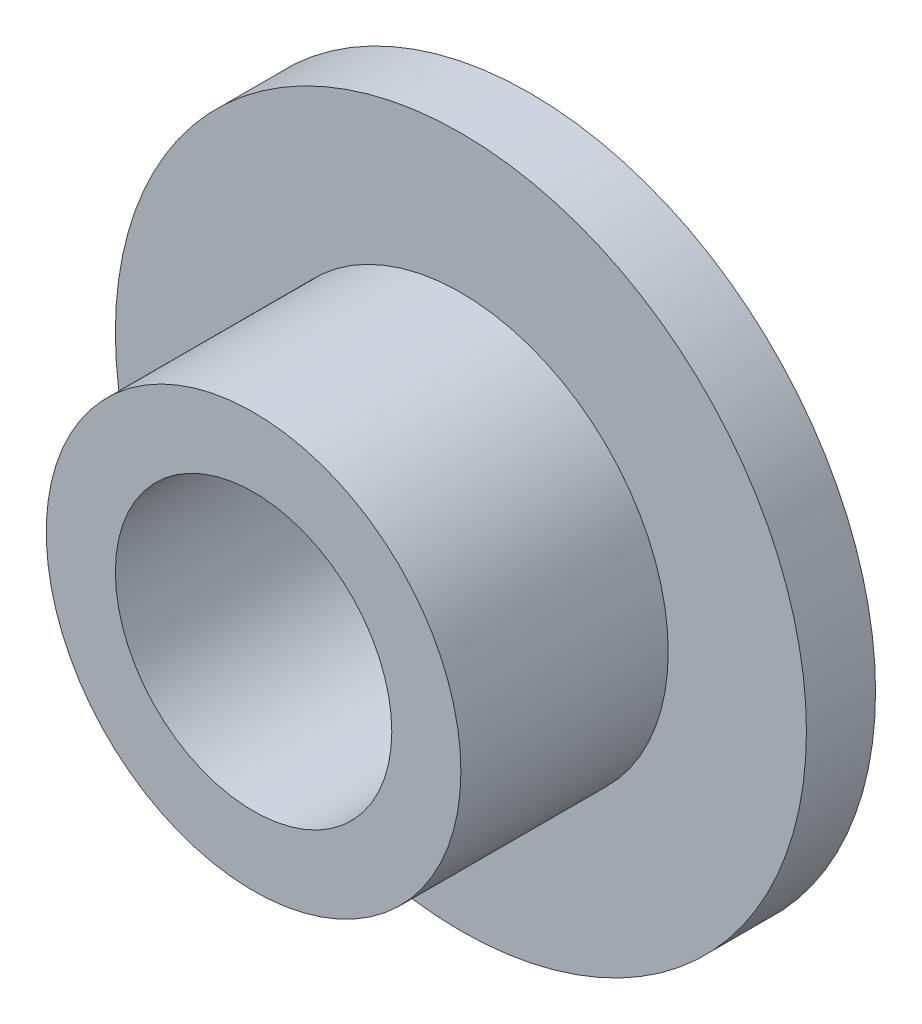
ISO-10303-21;
HEADER;
FILE_DESCRIPTION(('STEP AP214'),'2;1');
FILE_NAME('part.step','',(''),(''),'','','');
FILE_SCHEMA(('AUTOMOTIVE_DESIGN { 1 0 10303 214 1 1 1 1 }'));
ENDSEC;
DATA;
#1=APPLICATION_CONTEXT('core data for automotive mechanical design processes');
#2=APPLICATION_PROTOCOL_DEFINITION('international standard','automotive_design',2000,#1);
#3=PRODUCT_CONTEXT('',#1,'mechanical');
#4=PRODUCT('Part','Part','',(#3));
#5=PRODUCT_RELATED_PRODUCT_CATEGORY('part','',(#4));
#6=PRODUCT_DEFINITION_FORMATION('','',#4);
#7=PRODUCT_DEFINITION_CONTEXT('part definition',#1,'design');
#8=PRODUCT_DEFINITION('design','',#6,#7);
#9=PRODUCT_DEFINITION_SHAPE('','',#8);
#10=(LENGTH_UNIT() NAMED_UNIT(*) SI_UNIT(.MILLI.,.METRE.));
#11=(NAMED_UNIT(*) PLANE_ANGLE_UNIT() SI_UNIT($,.RADIAN.));
#12=(NAMED_UNIT(*) SI_UNIT($,.STERADIAN.) SOLID_ANGLE_UNIT());
#13=UNCERTAINTY_MEASURE_WITH_UNIT(LENGTH_MEASURE(1.E-05),#10,'distance_accuracy_value','');
#14=(GEOMETRIC_REPRESENTATION_CONTEXT(3) GLOBAL_UNCERTAINTY_ASSIGNED_CONTEXT((#13)) GLOBAL_UNIT_ASSIGNED_CONTEXT((#10,
#11,#12)) REPRESENTATION_CONTEXT('',''));
#15=CARTESIAN_POINT('',(0.,0.,0.));
#16=DIRECTION('',(0.,0.,1.));
#17=DIRECTION('',(1.,0.,0.));
#18=AXIS2_PLACEMENT_3D('',#15,#16,#17);
#19=CARTESIAN_POINT('',(0.,0.,0.));
#20=DIRECTION('',(0.,0.,1.));
#21=DIRECTION('',(1.,0.,0.));
#22=AXIS2_PLACEMENT_3D('',#19,#20,#21);
#23=PLANE('',#22);
#24=CARTESIAN_POINT('',(0.,0.,0.));
#25=DIRECTION('',(0.,0.,1.));
#26=DIRECTION('',(1.,0.,0.));
#27=AXIS2_PLACEMENT_3D('',#24,#25,#26);
#28=CIRCLE('',#27,250.);
#29=CARTESIAN_POINT('',(-250.,0.,0.));
#30=VERTEX_POINT('',#29);
#31=EDGE_CURVE('E11',#30,#30,#28,.T.);
#32=ORIENTED_EDGE('',*,*,#31,.F.);
#33=EDGE_LOOP('',(#32));
#34=FACE_BOUND('',#33,.T.);
#35=ADVANCED_FACE('F16',(#34),#23,.F.);
#36=CARTESIAN_POINT('',(0.,0.,50.));
#37=DIRECTION('',(0.,0.,1.));
#38=DIRECTION('',(1.,0.,0.));
#39=AXIS2_PLACEMENT_3D('',#36,#37,#38);
#40=PLANE('',#39);
#41=CARTESIAN_POINT('',(0.,0.,50.));
#42=DIRECTION('',(0.,0.,-1.));
#43=DIRECTION('',(-1.,0.,0.));
#44=AXIS2_PLACEMENT_3D('',#41,#42,#43);
#45=CIRCLE('',#44,150.);
#46=CARTESIAN_POINT('',(150.,0.,50.));
#47=VERTEX_POINT('',#46);
#48=EDGE_CURVE('E20',#47,#47,#45,.T.);
#49=ORIENTED_EDGE('',*,*,#48,.T.);
#50=EDGE_LOOP('',(#49));
#51=FACE_BOUND('',#50,.T.);
#52=CARTESIAN_POINT('',(0.,0.,50.));
#53=DIRECTION('',(0.,0.,1.));
#54=DIRECTION('',(1.,0.,0.));
#55=AXIS2_PLACEMENT_3D('',#52,#53,#54);
#56=CIRCLE('',#55,250.);
#57=CARTESIAN_POINT('',(-250.,0.,50.));
#58=VERTEX_POINT('',#57);
#59=EDGE_CURVE('E63',#58,#58,#56,.T.);
#60=ORIENTED_EDGE('',*,*,#59,.T.);
#61=EDGE_LOOP('',(#60));
#62=FACE_BOUND('',#61,.T.);
#63=ADVANCED_FACE('F18',(#51,#62),#40,.T.);
#64=CARTESIAN_POINT('',(0.,0.,0.));
#65=DIRECTION('',(0.,0.,1.));
#66=DIRECTION('',(1.,0.,0.));
#67=AXIS2_PLACEMENT_3D('',#64,#65,#66);
#68=CYLINDRICAL_SURFACE('',#67,250.);
#69=ORIENTED_EDGE('',*,*,#59,.F.);
#70=DIRECTION('',(0.,0.,-1.));
#71=VECTOR('',#70,1.);
#72=CARTESIAN_POINT('',(-250.,0.,0.));
#73=LINE('',#72,#71);
#74=EDGE_CURVE('E27',#58,#30,#73,.T.);
#75=ORIENTED_EDGE('',*,*,#74,.T.);
#76=ORIENTED_EDGE('',*,*,#31,.T.);
#77=ORIENTED_EDGE('',*,*,#74,.F.);
#78=EDGE_LOOP('',(#69,#75,#76,#77));
#79=FACE_BOUND('',#78,.T.);
#80=ADVANCED_FACE('F84',(#79),#68,.T.);
#81=CARTESIAN_POINT('',(0.,0.,200.));
#82=DIRECTION('',(0.,0.,1.));
#83=DIRECTION('',(1.,0.,0.));
#84=AXIS2_PLACEMENT_3D('',#81,#82,#83);
#85=PLANE('',#84);
#86=CARTESIAN_POINT('',(0.,0.,200.));
#87=DIRECTION('',(0.,0.,-1.));
#88=DIRECTION('',(1.,0.,0.));
#89=AXIS2_PLACEMENT_3D('',#86,#87,#88);
#90=CIRCLE('',#89,100.);
#91=CARTESIAN_POINT('',(-100.,0.,200.));
#92=VERTEX_POINT('',#91);
#93=EDGE_CURVE('E79',#92,#92,#90,.T.);
#94=ORIENTED_EDGE('',*,*,#93,.T.);
#95=EDGE_LOOP('',(#94));
#96=FACE_BOUND('',#95,.T.);
#97=CARTESIAN_POINT('',(0.,0.,200.));
#98=DIRECTION('',(0.,0.,1.));
#99=DIRECTION('',(-1.,0.,0.));
#100=AXIS2_PLACEMENT_3D('',#97,#98,#99);
#101=CIRCLE('',#100,150.);
#102=CARTESIAN_POINT('',(150.,0.,200.));
#103=VERTEX_POINT('',#102);
#104=EDGE_CURVE('E71',#103,#103,#101,.T.);
#105=ORIENTED_EDGE('',*,*,#104,.T.);
#106=EDGE_LOOP('',(#105));
#107=FACE_BOUND('',#106,.T.);
#108=ADVANCED_FACE('F91',(#96,#107),#85,.T.);
#109=CARTESIAN_POINT('',(0.,0.,50.));
#110=DIRECTION('',(0.,0.,1.));
#111=DIRECTION('',(-1.,0.,0.));
#112=AXIS2_PLACEMENT_3D('',#109,#110,#111);
#113=CYLINDRICAL_SURFACE('',#112,150.);
#114=ORIENTED_EDGE('',*,*,#104,.F.);
#115=DIRECTION('',(0.,0.,-1.));
#116=VECTOR('',#115,1.);
#117=CARTESIAN_POINT('',(150.,0.,50.));
#118=LINE('',#117,#116);
#119=EDGE_CURVE('E55',#103,#47,#118,.T.);
#120=ORIENTED_EDGE('',*,*,#119,.T.);
#121=ORIENTED_EDGE('',*,*,#48,.F.);
#122=ORIENTED_EDGE('',*,*,#119,.F.);
#123=EDGE_LOOP('',(#114,#120,#121,#122));
#124=FACE_BOUND('',#123,.T.);
#125=ADVANCED_FACE('F104',(#124),#113,.T.);
#126=CARTESIAN_POINT('',(0.,0.,50.));
#127=DIRECTION('',(0.,0.,-1.));
#128=DIRECTION('',(0.,-1.,0.));
#129=AXIS2_PLACEMENT_3D('',#126,#127,#128);
#130=PLANE('',#129);
#131=CARTESIAN_POINT('',(0.,0.,50.));
#132=DIRECTION('',(0.,0.,-1.));
#133=DIRECTION('',(1.,0.,0.));
#134=AXIS2_PLACEMENT_3D('',#131,#132,#133);
#135=CIRCLE('',#134,100.);
#136=CARTESIAN_POINT('',(-100.,0.,50.));
#137=VERTEX_POINT('',#136);
#138=EDGE_CURVE('E76',#137,#137,#135,.T.);
#139=ORIENTED_EDGE('',*,*,#138,.F.);
#140=EDGE_LOOP('',(#139));
#141=FACE_BOUND('',#140,.T.);
#142=ADVANCED_FACE('F100',(#141),#130,.F.);
#143=CARTESIAN_POINT('',(0.,0.,125.));
#144=DIRECTION('',(0.,0.,-1.));
#145=DIRECTION('',(1.,0.,0.));
#146=AXIS2_PLACEMENT_3D('',#143,#144,#145);
#147=CYLINDRICAL_SURFACE('',#146,100.);
#148=ORIENTED_EDGE('',*,*,#93,.F.);
#149=DIRECTION('',(0.,0.,-1.));
#150=VECTOR('',#149,1.);
#151=CARTESIAN_POINT('',(-100.,0.,125.));
#152=LINE('',#151,#150);
#153=EDGE_CURVE('E170',#92,#137,#152,.T.);
#154=ORIENTED_EDGE('',*,*,#153,.T.);
#155=ORIENTED_EDGE('',*,*,#138,.T.);
#156=ORIENTED_EDGE('',*,*,#153,.F.);
#157=EDGE_LOOP('',(#148,#154,#155,#156));
#158=FACE_BOUND('',#157,.T.);
#159=ADVANCED_FACE('F97',(#158),#147,.F.);
#160=CLOSED_SHELL('',(#35,#63,#80,#108,#125,#142,#159));
#161=MANIFOLD_SOLID_BREP('B1',#160);
#162=ADVANCED_BREP_SHAPE_REPRESENTATION('',(#18,#161),#14);
#163=SHAPE_DEFINITION_REPRESENTATION(#9,#162);
ENDSEC;
END-ISO-10303-21;
